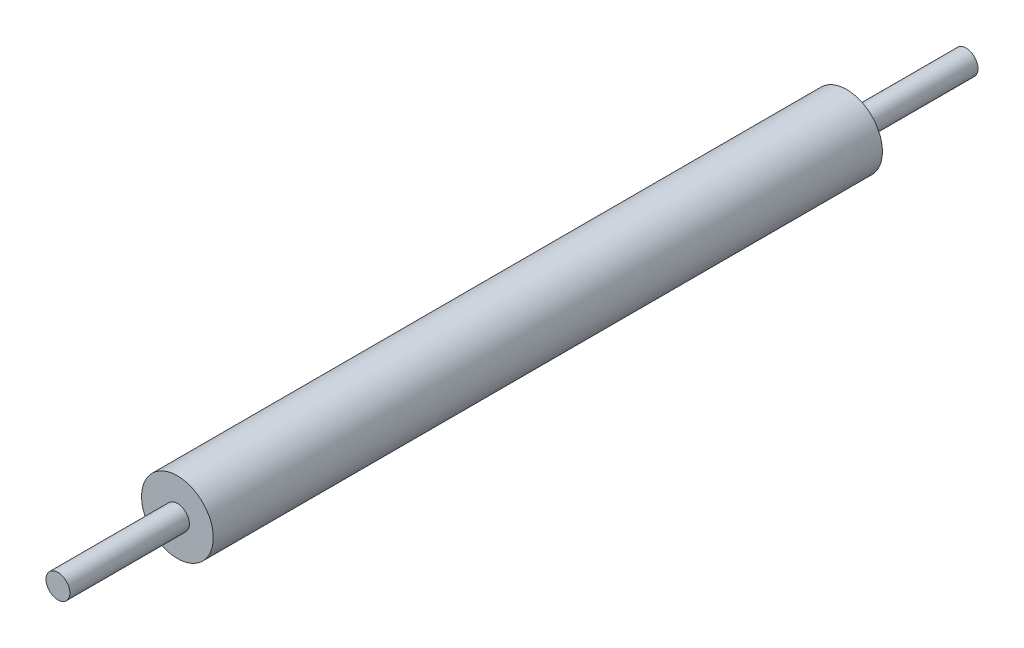
ISO-10303-21;
HEADER;
FILE_DESCRIPTION(('STEP AP214'),'2;1');
FILE_NAME('part.step','',(''),(''),'','','');
FILE_SCHEMA(('AUTOMOTIVE_DESIGN { 1 0 10303 214 1 1 1 1 }'));
ENDSEC;
DATA;
#1=APPLICATION_CONTEXT('core data for automotive mechanical design processes');
#2=APPLICATION_PROTOCOL_DEFINITION('international standard','automotive_design',2000,#1);
#3=PRODUCT_CONTEXT('',#1,'mechanical');
#4=PRODUCT('Part','Part','',(#3));
#5=PRODUCT_RELATED_PRODUCT_CATEGORY('part','',(#4));
#6=PRODUCT_DEFINITION_FORMATION('','',#4);
#7=PRODUCT_DEFINITION_CONTEXT('part definition',#1,'design');
#8=PRODUCT_DEFINITION('design','',#6,#7);
#9=PRODUCT_DEFINITION_SHAPE('','',#8);
#10=(LENGTH_UNIT() NAMED_UNIT(*) SI_UNIT(.MILLI.,.METRE.));
#11=(NAMED_UNIT(*) PLANE_ANGLE_UNIT() SI_UNIT($,.RADIAN.));
#12=(NAMED_UNIT(*) SI_UNIT($,.STERADIAN.) SOLID_ANGLE_UNIT());
#13=UNCERTAINTY_MEASURE_WITH_UNIT(LENGTH_MEASURE(1.E-05),#10,'distance_accuracy_value','');
#14=(GEOMETRIC_REPRESENTATION_CONTEXT(3) GLOBAL_UNCERTAINTY_ASSIGNED_CONTEXT((#13)) GLOBAL_UNIT_ASSIGNED_CONTEXT((#10,
#11,#12)) REPRESENTATION_CONTEXT('',''));
#15=CARTESIAN_POINT('',(0.,0.,0.));
#16=DIRECTION('',(0.,0.,1.));
#17=DIRECTION('',(1.,0.,0.));
#18=AXIS2_PLACEMENT_3D('',#15,#16,#17);
#19=CARTESIAN_POINT('',(0.,0.,711.2));
#20=DIRECTION('',(0.,0.,-1.));
#21=DIRECTION('',(-1.,0.,0.));
#22=AXIS2_PLACEMENT_3D('',#19,#20,#21);
#23=CYLINDRICAL_SURFACE('',#22,38.1);
#24=CARTESIAN_POINT('',(0.,0.,711.2));
#25=DIRECTION('',(0.,0.,1.));
#26=DIRECTION('',(1.,0.,0.));
#27=AXIS2_PLACEMENT_3D('',#24,#25,#26);
#28=CIRCLE('',#27,38.1);
#29=CARTESIAN_POINT('',(38.1,0.,711.2));
#30=VERTEX_POINT('',#29);
#31=EDGE_CURVE('E51',#30,#30,#28,.T.);
#32=ORIENTED_EDGE('',*,*,#31,.F.);
#33=EDGE_LOOP('',(#32));
#34=FACE_BOUND('',#33,.T.);
#35=CARTESIAN_POINT('',(0.,0.,0.));
#36=DIRECTION('',(0.,0.,1.));
#37=DIRECTION('',(1.,0.,0.));
#38=AXIS2_PLACEMENT_3D('',#35,#36,#37);
#39=CIRCLE('',#38,38.1);
#40=CARTESIAN_POINT('',(38.1,0.,0.));
#41=VERTEX_POINT('',#40);
#42=EDGE_CURVE('E40',#41,#41,#39,.T.);
#43=ORIENTED_EDGE('',*,*,#42,.T.);
#44=EDGE_LOOP('',(#43));
#45=FACE_BOUND('',#44,.T.);
#46=ADVANCED_FACE('F37',(#34,#45),#23,.T.);
#47=CARTESIAN_POINT('',(0.,0.,711.2));
#48=DIRECTION('',(0.,0.,1.));
#49=DIRECTION('',(1.,0.,0.));
#50=AXIS2_PLACEMENT_3D('',#47,#48,#49);
#51=PLANE('',#50);
#52=CARTESIAN_POINT('',(0.,0.,711.2));
#53=DIRECTION('',(0.,0.,1.));
#54=DIRECTION('',(1.,0.,0.));
#55=AXIS2_PLACEMENT_3D('',#52,#53,#54);
#56=CIRCLE('',#55,12.7);
#57=CARTESIAN_POINT('',(12.7,0.,711.2));
#58=VERTEX_POINT('',#57);
#59=EDGE_CURVE('E45',#58,#58,#56,.T.);
#60=ORIENTED_EDGE('',*,*,#59,.F.);
#61=EDGE_LOOP('',(#60));
#62=FACE_BOUND('',#61,.T.);
#63=ORIENTED_EDGE('',*,*,#31,.T.);
#64=EDGE_LOOP('',(#63));
#65=FACE_BOUND('',#64,.T.);
#66=ADVANCED_FACE('F71',(#62,#65),#51,.T.);
#67=CARTESIAN_POINT('',(0.,0.,0.));
#68=DIRECTION('',(0.,0.,1.));
#69=DIRECTION('',(1.,0.,0.));
#70=AXIS2_PLACEMENT_3D('',#67,#68,#69);
#71=PLANE('',#70);
#72=CARTESIAN_POINT('',(0.,0.,0.));
#73=DIRECTION('',(0.,0.,-1.));
#74=DIRECTION('',(-1.,0.,0.));
#75=AXIS2_PLACEMENT_3D('',#72,#73,#74);
#76=CIRCLE('',#75,12.7);
#77=CARTESIAN_POINT('',(-12.7,0.,0.));
#78=VERTEX_POINT('',#77);
#79=EDGE_CURVE('E10',#78,#78,#76,.T.);
#80=ORIENTED_EDGE('',*,*,#79,.F.);
#81=EDGE_LOOP('',(#80));
#82=FACE_BOUND('',#81,.T.);
#83=ORIENTED_EDGE('',*,*,#42,.F.);
#84=EDGE_LOOP('',(#83));
#85=FACE_BOUND('',#84,.T.);
#86=ADVANCED_FACE('F68',(#82,#85),#71,.F.);
#87=CARTESIAN_POINT('',(0.,0.,838.2));
#88=DIRECTION('',(0.,0.,-1.));
#89=DIRECTION('',(-1.,0.,0.));
#90=AXIS2_PLACEMENT_3D('',#87,#88,#89);
#91=CYLINDRICAL_SURFACE('',#90,12.7);
#92=CARTESIAN_POINT('',(0.,0.,838.2));
#93=DIRECTION('',(0.,0.,1.));
#94=DIRECTION('',(1.,0.,0.));
#95=AXIS2_PLACEMENT_3D('',#92,#93,#94);
#96=CIRCLE('',#95,12.7);
#97=CARTESIAN_POINT('',(12.7,0.,838.2));
#98=VERTEX_POINT('',#97);
#99=EDGE_CURVE('E56',#98,#98,#96,.T.);
#100=ORIENTED_EDGE('',*,*,#99,.F.);
#101=EDGE_LOOP('',(#100));
#102=FACE_BOUND('',#101,.T.);
#103=ORIENTED_EDGE('',*,*,#59,.T.);
#104=EDGE_LOOP('',(#103));
#105=FACE_BOUND('',#104,.T.);
#106=ADVANCED_FACE('F70',(#102,#105),#91,.T.);
#107=CARTESIAN_POINT('',(0.,0.,838.2));
#108=DIRECTION('',(0.,0.,1.));
#109=DIRECTION('',(1.,0.,0.));
#110=AXIS2_PLACEMENT_3D('',#107,#108,#109);
#111=PLANE('',#110);
#112=ORIENTED_EDGE('',*,*,#99,.T.);
#113=EDGE_LOOP('',(#112));
#114=FACE_BOUND('',#113,.T.);
#115=ADVANCED_FACE('F77',(#114),#111,.T.);
#116=CARTESIAN_POINT('',(0.,0.,-127.));
#117=DIRECTION('',(0.,0.,1.));
#118=DIRECTION('',(1.,0.,0.));
#119=AXIS2_PLACEMENT_3D('',#116,#117,#118);
#120=CYLINDRICAL_SURFACE('',#119,12.7);
#121=CARTESIAN_POINT('',(0.,0.,-127.));
#122=DIRECTION('',(0.,0.,-1.));
#123=DIRECTION('',(-1.,0.,0.));
#124=AXIS2_PLACEMENT_3D('',#121,#122,#123);
#125=CIRCLE('',#124,12.7);
#126=CARTESIAN_POINT('',(-12.7,0.,-127.));
#127=VERTEX_POINT('',#126);
#128=EDGE_CURVE('E55',#127,#127,#125,.T.);
#129=ORIENTED_EDGE('',*,*,#128,.F.);
#130=EDGE_LOOP('',(#129));
#131=FACE_BOUND('',#130,.T.);
#132=ORIENTED_EDGE('',*,*,#79,.T.);
#133=EDGE_LOOP('',(#132));
#134=FACE_BOUND('',#133,.T.);
#135=ADVANCED_FACE('F105',(#131,#134),#120,.T.);
#136=CARTESIAN_POINT('',(0.,0.,-127.));
#137=DIRECTION('',(0.,0.,-1.));
#138=DIRECTION('',(-1.,0.,0.));
#139=AXIS2_PLACEMENT_3D('',#136,#137,#138);
#140=PLANE('',#139);
#141=ORIENTED_EDGE('',*,*,#128,.T.);
#142=EDGE_LOOP('',(#141));
#143=FACE_BOUND('',#142,.T.);
#144=ADVANCED_FACE('F119',(#143),#140,.T.);
#145=CLOSED_SHELL('',(#46,#66,#86,#106,#115,#135,#144));
#146=MANIFOLD_SOLID_BREP('B2',#145);
#147=ADVANCED_BREP_SHAPE_REPRESENTATION('',(#18,#146),#14);
#148=SHAPE_DEFINITION_REPRESENTATION(#9,#147);
ENDSEC;
END-ISO-10303-21;
